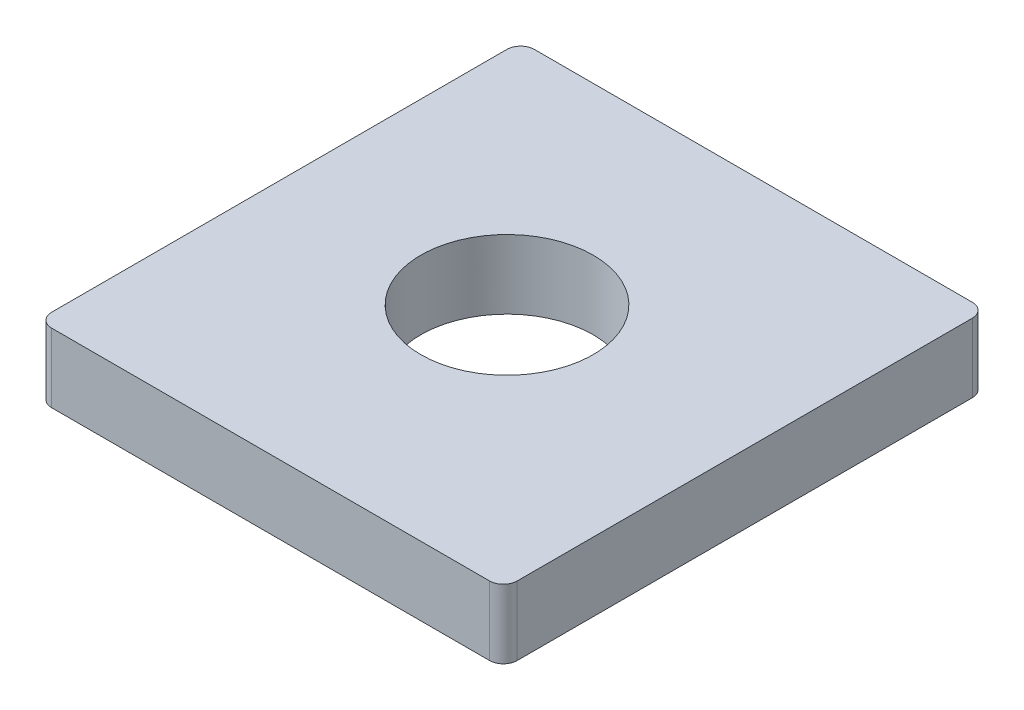
ISO-10303-21;
HEADER;
FILE_DESCRIPTION(('STEP AP214'),'2;1');
FILE_NAME('part.step','',(''),(''),'','','');
FILE_SCHEMA(('AUTOMOTIVE_DESIGN { 1 0 10303 214 1 1 1 1 }'));
ENDSEC;
DATA;
#1=APPLICATION_CONTEXT('core data for automotive mechanical design processes');
#2=APPLICATION_PROTOCOL_DEFINITION('international standard','automotive_design',2000,#1);
#3=PRODUCT_CONTEXT('',#1,'mechanical');
#4=PRODUCT('Part','Part','',(#3));
#5=PRODUCT_RELATED_PRODUCT_CATEGORY('part','',(#4));
#6=PRODUCT_DEFINITION_FORMATION('','',#4);
#7=PRODUCT_DEFINITION_CONTEXT('part definition',#1,'design');
#8=PRODUCT_DEFINITION('design','',#6,#7);
#9=PRODUCT_DEFINITION_SHAPE('','',#8);
#10=(LENGTH_UNIT() NAMED_UNIT(*) SI_UNIT(.MILLI.,.METRE.));
#11=(NAMED_UNIT(*) PLANE_ANGLE_UNIT() SI_UNIT($,.RADIAN.));
#12=(NAMED_UNIT(*) SI_UNIT($,.STERADIAN.) SOLID_ANGLE_UNIT());
#13=UNCERTAINTY_MEASURE_WITH_UNIT(LENGTH_MEASURE(1.E-05),#10,'distance_accuracy_value','');
#14=(GEOMETRIC_REPRESENTATION_CONTEXT(3) GLOBAL_UNCERTAINTY_ASSIGNED_CONTEXT((#13)) GLOBAL_UNIT_ASSIGNED_CONTEXT((#10,
#11,#12)) REPRESENTATION_CONTEXT('',''));
#15=CARTESIAN_POINT('',(0.,0.,0.));
#16=DIRECTION('',(0.,0.,1.));
#17=DIRECTION('',(1.,0.,0.));
#18=AXIS2_PLACEMENT_3D('',#15,#16,#17);
#19=CARTESIAN_POINT('',(5.20000000003594,6.7,-1.4));
#20=DIRECTION('',(0.,-1.,0.));
#21=DIRECTION('',(-0.707106781186546,0.,0.707106781186549));
#22=AXIS2_PLACEMENT_3D('',#19,#20,#21);
#23=CYLINDRICAL_SURFACE('',#22,0.2);
#24=CARTESIAN_POINT('',(5.20000000003594,6.2,-1.4));
#25=DIRECTION('',(0.,1.,0.));
#26=DIRECTION('',(-0.707106781186546,0.,0.707106781186549));
#27=AXIS2_PLACEMENT_3D('',#24,#25,#26);
#28=CIRCLE('',#27,0.2);
#29=CARTESIAN_POINT('',(5.00000000003594,6.2,-1.4));
#30=VERTEX_POINT('',#29);
#31=CARTESIAN_POINT('',(5.20000000003594,6.2,-1.2));
#32=VERTEX_POINT('',#31);
#33=EDGE_CURVE('E11',#30,#32,#28,.T.);
#34=ORIENTED_EDGE('',*,*,#33,.T.);
#35=DIRECTION('',(0.,1.,0.));
#36=VECTOR('',#35,1.);
#37=CARTESIAN_POINT('',(5.20000000003594,6.7,-1.2));
#38=LINE('',#37,#36);
#39=CARTESIAN_POINT('',(5.20000000003594,7.2,-1.2));
#40=VERTEX_POINT('',#39);
#41=EDGE_CURVE('E28',#32,#40,#38,.T.);
#42=ORIENTED_EDGE('',*,*,#41,.T.);
#43=CARTESIAN_POINT('',(5.20000000003594,7.2,-1.4));
#44=DIRECTION('',(0.,-1.,0.));
#45=DIRECTION('',(-0.707106781186546,0.,0.707106781186549));
#46=AXIS2_PLACEMENT_3D('',#43,#44,#45);
#47=CIRCLE('',#46,0.2);
#48=CARTESIAN_POINT('',(5.00000000003594,7.2,-1.4));
#49=VERTEX_POINT('',#48);
#50=EDGE_CURVE('E183',#40,#49,#47,.T.);
#51=ORIENTED_EDGE('',*,*,#50,.T.);
#52=DIRECTION('',(0.,-1.,0.));
#53=VECTOR('',#52,1.);
#54=CARTESIAN_POINT('',(5.00000000003594,6.7,-1.4));
#55=LINE('',#54,#53);
#56=EDGE_CURVE('E161',#49,#30,#55,.T.);
#57=ORIENTED_EDGE('',*,*,#56,.T.);
#58=EDGE_LOOP('',(#34,#42,#51,#57));
#59=FACE_BOUND('',#58,.T.);
#60=ADVANCED_FACE('F17',(#59),#23,.T.);
#61=CARTESIAN_POINT('',(5.00000000003594,6.7,-4.7));
#62=DIRECTION('',(1.,0.,0.));
#63=DIRECTION('',(0.,1.,0.));
#64=AXIS2_PLACEMENT_3D('',#61,#62,#63);
#65=PLANE('',#64);
#66=ORIENTED_EDGE('',*,*,#56,.F.);
#67=DIRECTION('',(0.,0.,1.));
#68=VECTOR('',#67,1.);
#69=CARTESIAN_POINT('',(5.00000000003594,7.2,-4.7));
#70=LINE('',#69,#68);
#71=CARTESIAN_POINT('',(5.00000000003594,7.2,-8.));
#72=VERTEX_POINT('',#71);
#73=EDGE_CURVE('E176',#72,#49,#70,.T.);
#74=ORIENTED_EDGE('',*,*,#73,.F.);
#75=DIRECTION('',(0.,1.,0.));
#76=VECTOR('',#75,1.);
#77=CARTESIAN_POINT('',(5.00000000003594,6.7,-8.));
#78=LINE('',#77,#76);
#79=CARTESIAN_POINT('',(5.00000000003594,6.2,-8.));
#80=VERTEX_POINT('',#79);
#81=EDGE_CURVE('E137',#80,#72,#78,.T.);
#82=ORIENTED_EDGE('',*,*,#81,.F.);
#83=DIRECTION('',(0.,0.,-1.));
#84=VECTOR('',#83,1.);
#85=CARTESIAN_POINT('',(5.00000000003594,6.2,-4.7));
#86=LINE('',#85,#84);
#87=EDGE_CURVE('E133',#30,#80,#86,.T.);
#88=ORIENTED_EDGE('',*,*,#87,.F.);
#89=EDGE_LOOP('',(#66,#74,#82,#88));
#90=FACE_BOUND('',#89,.T.);
#91=ADVANCED_FACE('F234',(#90),#65,.F.);
#92=CARTESIAN_POINT('',(8.37499982958594,7.2,-4.7));
#93=DIRECTION('',(0.,1.,0.));
#94=DIRECTION('',(1.,0.,0.));
#95=AXIS2_PLACEMENT_3D('',#92,#93,#94);
#96=PLANE('',#95);
#97=ORIENTED_EDGE('',*,*,#50,.F.);
#98=DIRECTION('',(1.,0.,0.));
#99=VECTOR('',#98,1.);
#100=CARTESIAN_POINT('',(8.37499982958594,7.2,-1.2));
#101=LINE('',#100,#99);
#102=CARTESIAN_POINT('',(11.5499996591359,7.2,-1.2));
#103=VERTEX_POINT('',#102);
#104=EDGE_CURVE('E159',#40,#103,#101,.T.);
#105=ORIENTED_EDGE('',*,*,#104,.T.);
#106=CARTESIAN_POINT('',(11.5499996591359,7.2,-1.4));
#107=DIRECTION('',(0.,-1.,0.));
#108=DIRECTION('',(0.707106781186548,0.,0.707106781186548));
#109=AXIS2_PLACEMENT_3D('',#106,#107,#108);
#110=CIRCLE('',#109,0.2);
#111=CARTESIAN_POINT('',(11.7499996591359,7.2,-1.4));
#112=VERTEX_POINT('',#111);
#113=EDGE_CURVE('E211',#112,#103,#110,.T.);
#114=ORIENTED_EDGE('',*,*,#113,.F.);
#115=DIRECTION('',(0.,0.,-1.));
#116=VECTOR('',#115,1.);
#117=CARTESIAN_POINT('',(11.7499996591359,7.2,-4.7));
#118=LINE('',#117,#116);
#119=CARTESIAN_POINT('',(11.7499996591359,7.2,-8.));
#120=VERTEX_POINT('',#119);
#121=EDGE_CURVE('E162',#112,#120,#118,.T.);
#122=ORIENTED_EDGE('',*,*,#121,.T.);
#123=CARTESIAN_POINT('',(11.5499996591359,7.2,-8.));
#124=DIRECTION('',(0.,-1.,0.));
#125=DIRECTION('',(0.707106781186548,0.,-0.707106781186548));
#126=AXIS2_PLACEMENT_3D('',#123,#124,#125);
#127=CIRCLE('',#126,0.2);
#128=CARTESIAN_POINT('',(11.5499996591359,7.2,-8.2));
#129=VERTEX_POINT('',#128);
#130=EDGE_CURVE('E184',#129,#120,#127,.T.);
#131=ORIENTED_EDGE('',*,*,#130,.F.);
#132=DIRECTION('',(-1.,0.,0.));
#133=VECTOR('',#132,1.);
#134=CARTESIAN_POINT('',(8.37499982958594,7.2,-8.2));
#135=LINE('',#134,#133);
#136=CARTESIAN_POINT('',(5.20000000003594,7.2,-8.2));
#137=VERTEX_POINT('',#136);
#138=EDGE_CURVE('E174',#129,#137,#135,.T.);
#139=ORIENTED_EDGE('',*,*,#138,.T.);
#140=CARTESIAN_POINT('',(5.20000000003594,7.2,-8.));
#141=DIRECTION('',(0.,-1.,0.));
#142=DIRECTION('',(-0.707106781186548,0.,-0.707106781186548));
#143=AXIS2_PLACEMENT_3D('',#140,#141,#142);
#144=CIRCLE('',#143,0.2);
#145=EDGE_CURVE('E117',#72,#137,#144,.T.);
#146=ORIENTED_EDGE('',*,*,#145,.F.);
#147=ORIENTED_EDGE('',*,*,#73,.T.);
#148=EDGE_LOOP('',(#97,#105,#114,#122,#131,#139,#146,#147));
#149=FACE_BOUND('',#148,.T.);
#150=CARTESIAN_POINT('',(8.20935487747192,7.2,-4.79317724704742));
#151=DIRECTION('',(0.,-1.,0.));
#152=DIRECTION('',(0.,0.,1.));
#153=AXIS2_PLACEMENT_3D('',#150,#151,#152);
#154=CIRCLE('',#153,1.25);
#155=CARTESIAN_POINT('',(8.20935487747192,7.2,-3.54317724704742));
#156=VERTEX_POINT('',#155);
#157=CARTESIAN_POINT('',(8.20935487747192,7.2,-6.04317724704742));
#158=VERTEX_POINT('',#157);
#159=EDGE_CURVE('E157',#156,#158,#154,.T.);
#160=ORIENTED_EDGE('',*,*,#159,.T.);
#161=CARTESIAN_POINT('',(8.20935487747192,7.2,-4.79317724704742));
#162=DIRECTION('',(0.,-1.,0.));
#163=DIRECTION('',(0.,0.,1.));
#164=AXIS2_PLACEMENT_3D('',#161,#162,#163);
#165=CIRCLE('',#164,1.25);
#166=EDGE_CURVE('E136',#158,#156,#165,.T.);
#167=ORIENTED_EDGE('',*,*,#166,.T.);
#168=EDGE_LOOP('',(#160,#167));
#169=FACE_BOUND('',#168,.T.);
#170=ADVANCED_FACE('F232',(#149,#169),#96,.T.);
#171=CARTESIAN_POINT('',(5.20000000003594,6.7,-8.));
#172=DIRECTION('',(0.,-1.,0.));
#173=DIRECTION('',(-0.707106781186548,0.,-0.707106781186548));
#174=AXIS2_PLACEMENT_3D('',#171,#172,#173);
#175=CYLINDRICAL_SURFACE('',#174,0.2);
#176=CARTESIAN_POINT('',(5.20000000003594,6.2,-8.));
#177=DIRECTION('',(0.,1.,0.));
#178=DIRECTION('',(-0.707106781186548,0.,-0.707106781186548));
#179=AXIS2_PLACEMENT_3D('',#176,#177,#178);
#180=CIRCLE('',#179,0.2);
#181=CARTESIAN_POINT('',(5.20000000003594,6.2,-8.2));
#182=VERTEX_POINT('',#181);
#183=EDGE_CURVE('E115',#182,#80,#180,.T.);
#184=ORIENTED_EDGE('',*,*,#183,.T.);
#185=ORIENTED_EDGE('',*,*,#81,.T.);
#186=ORIENTED_EDGE('',*,*,#145,.T.);
#187=DIRECTION('',(0.,-1.,0.));
#188=VECTOR('',#187,1.);
#189=CARTESIAN_POINT('',(5.20000000003594,6.7,-8.2));
#190=LINE('',#189,#188);
#191=EDGE_CURVE('E112',#137,#182,#190,.T.);
#192=ORIENTED_EDGE('',*,*,#191,.T.);
#193=EDGE_LOOP('',(#184,#185,#186,#192));
#194=FACE_BOUND('',#193,.T.);
#195=ADVANCED_FACE('F114',(#194),#175,.T.);
#196=CARTESIAN_POINT('',(8.37499982958594,6.7,-8.2));
#197=DIRECTION('',(0.,0.,1.));
#198=DIRECTION('',(1.,0.,0.));
#199=AXIS2_PLACEMENT_3D('',#196,#197,#198);
#200=PLANE('',#199);
#201=ORIENTED_EDGE('',*,*,#191,.F.);
#202=ORIENTED_EDGE('',*,*,#138,.F.);
#203=DIRECTION('',(0.,1.,0.));
#204=VECTOR('',#203,1.);
#205=CARTESIAN_POINT('',(11.5499996591359,6.7,-8.2));
#206=LINE('',#205,#204);
#207=CARTESIAN_POINT('',(11.5499996591359,6.2,-8.2));
#208=VERTEX_POINT('',#207);
#209=EDGE_CURVE('E140',#208,#129,#206,.T.);
#210=ORIENTED_EDGE('',*,*,#209,.F.);
#211=DIRECTION('',(1.,0.,0.));
#212=VECTOR('',#211,1.);
#213=CARTESIAN_POINT('',(8.37499982958594,6.2,-8.2));
#214=LINE('',#213,#212);
#215=EDGE_CURVE('E130',#182,#208,#214,.T.);
#216=ORIENTED_EDGE('',*,*,#215,.F.);
#217=EDGE_LOOP('',(#201,#202,#210,#216));
#218=FACE_BOUND('',#217,.T.);
#219=ADVANCED_FACE('F138',(#218),#200,.F.);
#220=CARTESIAN_POINT('',(11.5499996591359,6.7,-1.4));
#221=DIRECTION('',(0.,-1.,0.));
#222=DIRECTION('',(0.707106781186548,0.,0.707106781186548));
#223=AXIS2_PLACEMENT_3D('',#220,#221,#222);
#224=CYLINDRICAL_SURFACE('',#223,0.2);
#225=CARTESIAN_POINT('',(11.5499996591359,6.2,-1.4));
#226=DIRECTION('',(0.,1.,0.));
#227=DIRECTION('',(0.707106781186548,0.,0.707106781186548));
#228=AXIS2_PLACEMENT_3D('',#225,#226,#227);
#229=CIRCLE('',#228,0.2);
#230=CARTESIAN_POINT('',(11.5499996591359,6.2,-1.2));
#231=VERTEX_POINT('',#230);
#232=CARTESIAN_POINT('',(11.7499996591359,6.2,-1.4));
#233=VERTEX_POINT('',#232);
#234=EDGE_CURVE('E123',#231,#233,#229,.T.);
#235=ORIENTED_EDGE('',*,*,#234,.T.);
#236=DIRECTION('',(0.,1.,0.));
#237=VECTOR('',#236,1.);
#238=CARTESIAN_POINT('',(11.7499996591359,6.7,-1.4));
#239=LINE('',#238,#237);
#240=EDGE_CURVE('E204',#233,#112,#239,.T.);
#241=ORIENTED_EDGE('',*,*,#240,.T.);
#242=ORIENTED_EDGE('',*,*,#113,.T.);
#243=DIRECTION('',(0.,-1.,0.));
#244=VECTOR('',#243,1.);
#245=CARTESIAN_POINT('',(11.5499996591359,6.7,-1.2));
#246=LINE('',#245,#244);
#247=EDGE_CURVE('E170',#103,#231,#246,.T.);
#248=ORIENTED_EDGE('',*,*,#247,.T.);
#249=EDGE_LOOP('',(#235,#241,#242,#248));
#250=FACE_BOUND('',#249,.T.);
#251=ADVANCED_FACE('F255',(#250),#224,.T.);
#252=CARTESIAN_POINT('',(8.37499982958594,6.7,-1.2));
#253=DIRECTION('',(0.,0.,-1.));
#254=DIRECTION('',(0.,-1.,0.));
#255=AXIS2_PLACEMENT_3D('',#252,#253,#254);
#256=PLANE('',#255);
#257=ORIENTED_EDGE('',*,*,#41,.F.);
#258=DIRECTION('',(-1.,0.,0.));
#259=VECTOR('',#258,1.);
#260=CARTESIAN_POINT('',(8.37499982958594,6.2,-1.2));
#261=LINE('',#260,#259);
#262=EDGE_CURVE('E153',#231,#32,#261,.T.);
#263=ORIENTED_EDGE('',*,*,#262,.F.);
#264=ORIENTED_EDGE('',*,*,#247,.F.);
#265=ORIENTED_EDGE('',*,*,#104,.F.);
#266=EDGE_LOOP('',(#257,#263,#264,#265));
#267=FACE_BOUND('',#266,.T.);
#268=ADVANCED_FACE('F252',(#267),#256,.F.);
#269=CARTESIAN_POINT('',(11.5499996591359,6.7,-8.));
#270=DIRECTION('',(0.,-1.,0.));
#271=DIRECTION('',(0.707106781186548,0.,-0.707106781186548));
#272=AXIS2_PLACEMENT_3D('',#269,#270,#271);
#273=CYLINDRICAL_SURFACE('',#272,0.2);
#274=CARTESIAN_POINT('',(11.5499996591359,6.2,-8.));
#275=DIRECTION('',(0.,1.,0.));
#276=DIRECTION('',(0.707106781186548,0.,-0.707106781186548));
#277=AXIS2_PLACEMENT_3D('',#274,#275,#276);
#278=CIRCLE('',#277,0.2);
#279=CARTESIAN_POINT('',(11.7499996591359,6.2,-8.));
#280=VERTEX_POINT('',#279);
#281=EDGE_CURVE('E167',#280,#208,#278,.T.);
#282=ORIENTED_EDGE('',*,*,#281,.T.);
#283=ORIENTED_EDGE('',*,*,#209,.T.);
#284=ORIENTED_EDGE('',*,*,#130,.T.);
#285=DIRECTION('',(0.,-1.,0.));
#286=VECTOR('',#285,1.);
#287=CARTESIAN_POINT('',(11.7499996591359,6.7,-8.));
#288=LINE('',#287,#286);
#289=EDGE_CURVE('E149',#120,#280,#288,.T.);
#290=ORIENTED_EDGE('',*,*,#289,.T.);
#291=EDGE_LOOP('',(#282,#283,#284,#290));
#292=FACE_BOUND('',#291,.T.);
#293=ADVANCED_FACE('F19',(#292),#273,.T.);
#294=CARTESIAN_POINT('',(8.37499982958594,6.2,-4.7));
#295=DIRECTION('',(0.,1.,0.));
#296=DIRECTION('',(1.,0.,0.));
#297=AXIS2_PLACEMENT_3D('',#294,#295,#296);
#298=PLANE('',#297);
#299=ORIENTED_EDGE('',*,*,#33,.F.);
#300=ORIENTED_EDGE('',*,*,#87,.T.);
#301=ORIENTED_EDGE('',*,*,#183,.F.);
#302=ORIENTED_EDGE('',*,*,#215,.T.);
#303=ORIENTED_EDGE('',*,*,#281,.F.);
#304=DIRECTION('',(0.,0.,1.));
#305=VECTOR('',#304,1.);
#306=CARTESIAN_POINT('',(11.7499996591359,6.2,-4.7));
#307=LINE('',#306,#305);
#308=EDGE_CURVE('E143',#280,#233,#307,.T.);
#309=ORIENTED_EDGE('',*,*,#308,.T.);
#310=ORIENTED_EDGE('',*,*,#234,.F.);
#311=ORIENTED_EDGE('',*,*,#262,.T.);
#312=EDGE_LOOP('',(#299,#300,#301,#302,#303,#309,#310,#311));
#313=FACE_BOUND('',#312,.T.);
#314=CARTESIAN_POINT('',(8.20935487747192,6.2,-4.79317724704742));
#315=DIRECTION('',(0.,1.,0.));
#316=DIRECTION('',(0.,0.,1.));
#317=AXIS2_PLACEMENT_3D('',#314,#315,#316);
#318=CIRCLE('',#317,1.25);
#319=CARTESIAN_POINT('',(8.20935487747192,6.2,-6.04317724704742));
#320=VERTEX_POINT('',#319);
#321=EDGE_CURVE('E190',#320,#320,#318,.T.);
#322=ORIENTED_EDGE('',*,*,#321,.T.);
#323=EDGE_LOOP('',(#322));
#324=FACE_BOUND('',#323,.T.);
#325=ADVANCED_FACE('F127',(#313,#324),#298,.F.);
#326=CARTESIAN_POINT('',(8.20935487747192,5.7,-4.79317724704742));
#327=DIRECTION('',(0.,-1.,0.));
#328=DIRECTION('',(0.,0.,1.));
#329=AXIS2_PLACEMENT_3D('',#326,#327,#328);
#330=CYLINDRICAL_SURFACE('',#329,1.25);
#331=ORIENTED_EDGE('',*,*,#159,.F.);
#332=ORIENTED_EDGE('',*,*,#166,.F.);
#333=DIRECTION('',(0.,-1.,0.));
#334=VECTOR('',#333,1.);
#335=CARTESIAN_POINT('',(8.20935487747192,5.7,-6.04317724704742));
#336=LINE('',#335,#334);
#337=EDGE_CURVE('E21',#158,#320,#336,.T.);
#338=ORIENTED_EDGE('',*,*,#337,.T.);
#339=ORIENTED_EDGE('',*,*,#321,.F.);
#340=ORIENTED_EDGE('',*,*,#337,.F.);
#341=EDGE_LOOP('',(#331,#332,#338,#339,#340));
#342=FACE_BOUND('',#341,.T.);
#343=ADVANCED_FACE('F229',(#342),#330,.F.);
#344=CARTESIAN_POINT('',(11.7499996591359,6.7,-4.7));
#345=DIRECTION('',(-1.,0.,0.));
#346=DIRECTION('',(0.,0.,1.));
#347=AXIS2_PLACEMENT_3D('',#344,#345,#346);
#348=PLANE('',#347);
#349=ORIENTED_EDGE('',*,*,#240,.F.);
#350=ORIENTED_EDGE('',*,*,#308,.F.);
#351=ORIENTED_EDGE('',*,*,#289,.F.);
#352=ORIENTED_EDGE('',*,*,#121,.F.);
#353=EDGE_LOOP('',(#349,#350,#351,#352));
#354=FACE_BOUND('',#353,.T.);
#355=ADVANCED_FACE('F260',(#354),#348,.F.);
#356=CLOSED_SHELL('',(#60,#91,#170,#195,#219,#251,#268,#293,#325,#343,#355));
#357=MANIFOLD_SOLID_BREP('B1',#356);
#358=ADVANCED_BREP_SHAPE_REPRESENTATION('',(#18,#357),#14);
#359=SHAPE_DEFINITION_REPRESENTATION(#9,#358);
ENDSEC;
END-ISO-10303-21;
